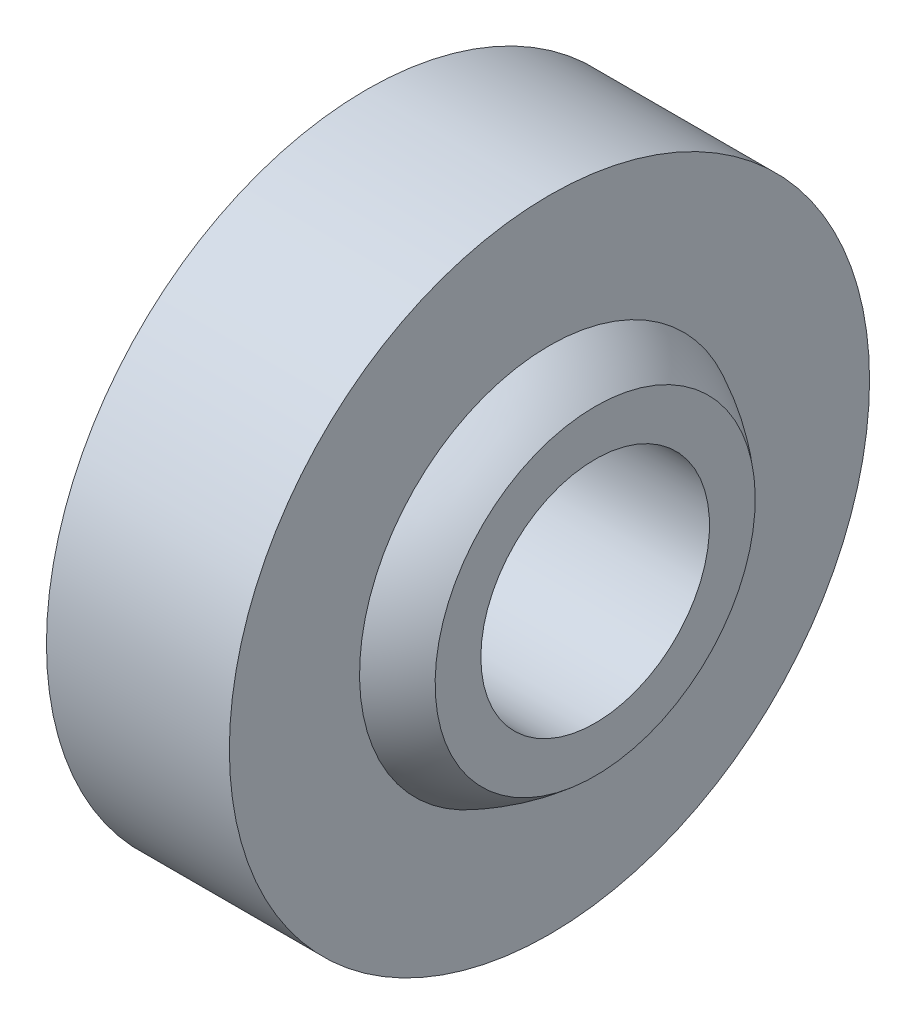
ISO-10303-21;
HEADER;
FILE_DESCRIPTION(('STEP AP214'),'2;1');
FILE_NAME('part.step','',(''),(''),'','','');
FILE_SCHEMA(('AUTOMOTIVE_DESIGN { 1 0 10303 214 1 1 1 1 }'));
ENDSEC;
DATA;
#1=APPLICATION_CONTEXT('core data for automotive mechanical design processes');
#2=APPLICATION_PROTOCOL_DEFINITION('international standard','automotive_design',2000,#1);
#3=PRODUCT_CONTEXT('',#1,'mechanical');
#4=PRODUCT('Part','Part','',(#3));
#5=PRODUCT_RELATED_PRODUCT_CATEGORY('part','',(#4));
#6=PRODUCT_DEFINITION_FORMATION('','',#4);
#7=PRODUCT_DEFINITION_CONTEXT('part definition',#1,'design');
#8=PRODUCT_DEFINITION('design','',#6,#7);
#9=PRODUCT_DEFINITION_SHAPE('','',#8);
#10=(LENGTH_UNIT() NAMED_UNIT(*) SI_UNIT(.MILLI.,.METRE.));
#11=(NAMED_UNIT(*) PLANE_ANGLE_UNIT() SI_UNIT($,.RADIAN.));
#12=(NAMED_UNIT(*) SI_UNIT($,.STERADIAN.) SOLID_ANGLE_UNIT());
#13=UNCERTAINTY_MEASURE_WITH_UNIT(LENGTH_MEASURE(1.E-05),#10,'distance_accuracy_value','');
#14=(GEOMETRIC_REPRESENTATION_CONTEXT(3) GLOBAL_UNCERTAINTY_ASSIGNED_CONTEXT((#13)) GLOBAL_UNIT_ASSIGNED_CONTEXT((#10,
#11,#12)) REPRESENTATION_CONTEXT('',''));
#15=CARTESIAN_POINT('',(0.,0.,0.));
#16=DIRECTION('',(0.,0.,1.));
#17=DIRECTION('',(1.,0.,0.));
#18=AXIS2_PLACEMENT_3D('',#15,#16,#17);
#19=CARTESIAN_POINT('',(0.,0.,0.));
#20=DIRECTION('',(-1.,0.,0.));
#21=DIRECTION('',(0.,1.,0.));
#22=AXIS2_PLACEMENT_3D('',#19,#20,#21);
#23=SPHERICAL_SURFACE('',#22,4.60977222864644);
#24=CARTESIAN_POINT('',(-3.,0.,0.));
#25=DIRECTION('',(-1.,0.,0.));
#26=DIRECTION('',(0.,0.,1.));
#27=AXIS2_PLACEMENT_3D('',#24,#25,#26);
#28=CIRCLE('',#27,3.5);
#29=CARTESIAN_POINT('',(-3.,3.5,0.));
#30=VERTEX_POINT('',#29);
#31=EDGE_CURVE('E48',#30,#30,#28,.T.);
#32=CARTESIAN_POINT('',(-2.,0.,0.));
#33=DIRECTION('',(1.,0.,0.));
#34=DIRECTION('',(0.,0.,-1.));
#35=AXIS2_PLACEMENT_3D('',#32,#33,#34);
#36=CIRCLE('',#35,4.15331193145904);
#37=CARTESIAN_POINT('',(-2.,4.15331193145904,0.));
#38=VERTEX_POINT('',#37);
#39=EDGE_CURVE('E10',#38,#38,#36,.T.);
#40=CARTESIAN_POINT('',(-3.,3.5,0.));
#41=CARTESIAN_POINT('',(-2.99052620611061,3.50812039634238,0.));
#42=CARTESIAN_POINT('',(-2.98101944028967,3.51620232540534,0.));
#43=CARTESIAN_POINT('',(-2.96194059506185,3.53228872007487,0.));
#44=CARTESIAN_POINT('',(-2.95236851565497,3.54029318568143,0.));
#45=CARTESIAN_POINT('',(-2.93315967353245,3.55622412454056,0.));
#46=CARTESIAN_POINT('',(-2.92352291081681,3.56415059779313,0.));
#47=CARTESIAN_POINT('',(-2.90418533777321,3.57992502955823,0.));
#48=CARTESIAN_POINT('',(-2.89448452744525,3.58777298807076,0.));
#49=CARTESIAN_POINT('',(-2.87501949878755,3.60338987278029,0.));
#50=CARTESIAN_POINT('',(-2.86525528045781,3.61115879897729,0.));
#51=CARTESIAN_POINT('',(-2.8456640796711,3.62661710678996,0.));
#52=CARTESIAN_POINT('',(-2.83583709721413,3.63430648840563,0.));
#53=CARTESIAN_POINT('',(-2.81612101616401,3.64960520000871,0.));
#54=CARTESIAN_POINT('',(-2.80623191757087,3.65721452999613,0.));
#55=CARTESIAN_POINT('',(-2.78639225634135,3.67235263658149,0.));
#56=CARTESIAN_POINT('',(-2.77644169370499,3.67988141317943,0.));
#57=CARTESIAN_POINT('',(-2.75647976053338,3.69485791653445,0.));
#58=CARTESIAN_POINT('',(-2.74646838999813,3.70230564329153,0.));
#59=CARTESIAN_POINT('',(-2.72638550118322,3.71711955585841,0.));
#60=CARTESIAN_POINT('',(-2.71631398290356,3.72448574166821,0.));
#61=CARTESIAN_POINT('',(-2.69611146272033,3.73913608661081,0.));
#62=CARTESIAN_POINT('',(-2.68598046081677,3.74642024574362,0.));
#63=CARTESIAN_POINT('',(-2.66565964142868,3.76090605701146,0.));
#64=CARTESIAN_POINT('',(-2.65546982394415,3.76810770914649,0.));
#65=CARTESIAN_POINT('',(-2.63503204531536,3.78242803153852,0.));
#66=CARTESIAN_POINT('',(-2.6247840841711,3.78954670179551,0.));
#67=CARTESIAN_POINT('',(-2.60423069397813,3.80370059102309,0.));
#68=CARTESIAN_POINT('',(-2.59392526492941,3.81073580999366,0.));
#69=CARTESIAN_POINT('',(-2.57325761847225,3.82472233274282,0.));
#70=CARTESIAN_POINT('',(-2.56289540106381,3.83167363652141,0.));
#71=CARTESIAN_POINT('',(-2.54211486117656,3.84549187051442,0.));
#72=CARTESIAN_POINT('',(-2.53169653869776,3.85235880072884,0.));
#73=CARTESIAN_POINT('',(-2.51080447565878,3.866007834785,0.));
#74=CARTESIAN_POINT('',(-2.5003307350986,3.87278993862674,0.));
#75=CARTESIAN_POINT('',(-2.47932852654012,3.88626887272247,0.));
#76=CARTESIAN_POINT('',(-2.46880005854182,3.89296570297647,0.));
#77=CARTESIAN_POINT('',(-2.44768908935913,3.90627364830467,0.));
#78=CARTESIAN_POINT('',(-2.43710658817473,3.91288476337887,0.));
#79=CARTESIAN_POINT('',(-2.41588825043483,3.9260208424075,0.));
#80=CARTESIAN_POINT('',(-2.40525241387933,3.93254580636194,0.));
#81=CARTESIAN_POINT('',(-2.38392810672916,3.94550915289192,0.));
#82=CARTESIAN_POINT('',(-2.3732396361345,3.95194753546746,0.));
#83=CARTESIAN_POINT('',(-2.35181076570868,3.96473729468976,0.));
#84=CARTESIAN_POINT('',(-2.34107036587753,3.97108867133652,0.));
#85=CARTESIAN_POINT('',(-2.31953834520562,3.98370399988854,0.));
#86=CARTESIAN_POINT('',(-2.30874672436486,3.9899679517938,0.));
#87=CARTESIAN_POINT('',(-2.28711297327821,4.002408017815,0.));
#88=CARTESIAN_POINT('',(-2.27627084303231,4.00858413193093,0.));
#89=CARTESIAN_POINT('',(-2.25453678807035,4.02084811511754,0.));
#90=CARTESIAN_POINT('',(-2.2436448633543,4.02693598418822,0.));
#91=CARTESIAN_POINT('',(-2.22181193767078,4.03902307584791,0.));
#92=CARTESIAN_POINT('',(-2.21087093670332,4.04502229843691,0.));
#93=CARTESIAN_POINT('',(-2.18894057997077,4.05693170154001,0.));
#94=CARTESIAN_POINT('',(-2.17795122420567,4.0628418820541,0.));
#95=CARTESIAN_POINT('',(-2.15592488252423,4.07457281129388,0.));
#96=CARTESIAN_POINT('',(-2.14488789660788,4.08039356001957,0.));
#97=CARTESIAN_POINT('',(-2.12276702239587,4.09194524183532,0.));
#98=CARTESIAN_POINT('',(-2.11168313410021,4.09767617492539,0.));
#99=CARTESIAN_POINT('',(-2.08946918605098,4.1090478476605,0.));
#100=CARTESIAN_POINT('',(-2.07833912629741,4.11468858730555,0.));
#101=CARTESIAN_POINT('',(-2.05603356908673,4.12587950085816,0.));
#102=CARTESIAN_POINT('',(-2.04485807162961,4.13142967476571,0.));
#103=CARTESIAN_POINT('',(-2.02246237655214,4.14243909212941,0.));
#104=CARTESIAN_POINT('',(-2.01124217893179,4.14789833558556,0.));
#105=CARTESIAN_POINT('',(-2.,4.15331193145904,0.));
#106=B_SPLINE_CURVE_WITH_KNOTS('',3,(#40,#41,#42,#43,#44,#45,#46,#47,#48,#49,#50,#51,#52,#53,
#54,#55,#56,#57,#58,#59,#60,#61,#62,#63,#64,#65,#66,#67,#68,#69,#70,#71,#72,#73,#74,#75,#76,#77,
#78,#79,#80,#81,#82,#83,#84,#85,#86,#87,#88,#89,#90,#91,#92,#93,#94,#95,#96,#97,#98,#99,#100,
#101,#102,#103,#104,#105),.UNSPECIFIED.,.F.,.F.,(4,2,2,2,2,2,2,2,2,2,2,2,2,2,2,2,2,2,2,2,2,2,2,
2,2,2,2,2,2,2,2,2,4),(0.,0.0374330704687181,0.0748661409374359,0.112299211406154,
0.149732281874872,0.187165352343589,0.224598422812307,0.262031493281025,0.299464563749743,
0.336897634218461,0.374330704687179,0.411763775155897,0.449196845624614,0.486629916093332,
0.52406298656205,0.561496057030768,0.598929127499486,0.636362197968204,0.673795268436922,
0.711228338905639,0.748661409374358,0.786094479843075,0.823527550311794,0.860960620780511,
0.898393691249229,0.935826761717947,0.973259832186665,1.01069290265538,1.0481259731241,
1.08555904359282,1.12299211406154,1.16042518453025,1.19785825499897),.UNSPECIFIED.);
#107=EDGE_CURVE('BSEAM38',#30,#38,#106,.T.);
#108=ORIENTED_EDGE('',*,*,#31,.F.);
#109=ORIENTED_EDGE('',*,*,#39,.F.);
#110=ORIENTED_EDGE('',*,*,#107,.T.);
#111=ORIENTED_EDGE('',*,*,#107,.F.);
#112=EDGE_LOOP('',(#108,#110,#109,#111));
#113=FACE_BOUND('',#112,.T.);
#114=ADVANCED_FACE('F38',(#113),#23,.T.);
#115=CARTESIAN_POINT('',(3.,0.,0.));
#116=DIRECTION('',(-1.,0.,0.));
#117=DIRECTION('',(0.,0.,1.));
#118=AXIS2_PLACEMENT_3D('',#115,#116,#117);
#119=CIRCLE('',#118,3.5);
#120=CARTESIAN_POINT('',(3.,3.5,0.));
#121=VERTEX_POINT('',#120);
#122=EDGE_CURVE('E60',#121,#121,#119,.T.);
#123=CARTESIAN_POINT('',(2.,0.,0.));
#124=DIRECTION('',(-1.,0.,0.));
#125=DIRECTION('',(0.,0.,1.));
#126=AXIS2_PLACEMENT_3D('',#123,#124,#125);
#127=CIRCLE('',#126,4.15331193145904);
#128=CARTESIAN_POINT('',(2.,4.15331193145904,0.));
#129=VERTEX_POINT('',#128);
#130=EDGE_CURVE('E44',#129,#129,#127,.T.);
#131=CARTESIAN_POINT('',(3.,3.5,0.));
#132=CARTESIAN_POINT('',(2.99052620611061,3.50812039634238,0.));
#133=CARTESIAN_POINT('',(2.98101944028967,3.51620232540534,0.));
#134=CARTESIAN_POINT('',(2.96194059506185,3.53228872007487,0.));
#135=CARTESIAN_POINT('',(2.95236851565497,3.54029318568143,0.));
#136=CARTESIAN_POINT('',(2.93315967353245,3.55622412454056,0.));
#137=CARTESIAN_POINT('',(2.92352291081681,3.56415059779313,0.));
#138=CARTESIAN_POINT('',(2.90418533777321,3.57992502955823,0.));
#139=CARTESIAN_POINT('',(2.89448452744525,3.58777298807076,0.));
#140=CARTESIAN_POINT('',(2.87501949878755,3.60338987278029,0.));
#141=CARTESIAN_POINT('',(2.86525528045781,3.61115879897729,0.));
#142=CARTESIAN_POINT('',(2.8456640796711,3.62661710678996,0.));
#143=CARTESIAN_POINT('',(2.83583709721413,3.63430648840563,0.));
#144=CARTESIAN_POINT('',(2.81612101616401,3.64960520000871,0.));
#145=CARTESIAN_POINT('',(2.80623191757086,3.65721452999613,0.));
#146=CARTESIAN_POINT('',(2.78639225634135,3.67235263658149,0.));
#147=CARTESIAN_POINT('',(2.77644169370499,3.67988141317943,0.));
#148=CARTESIAN_POINT('',(2.75647976053338,3.69485791653445,0.));
#149=CARTESIAN_POINT('',(2.74646838999813,3.70230564329153,0.));
#150=CARTESIAN_POINT('',(2.72638550118322,3.71711955585841,0.));
#151=CARTESIAN_POINT('',(2.71631398290356,3.72448574166821,0.));
#152=CARTESIAN_POINT('',(2.69611146272034,3.73913608661081,0.));
#153=CARTESIAN_POINT('',(2.68598046081677,3.74642024574362,0.));
#154=CARTESIAN_POINT('',(2.66565964142868,3.76090605701146,0.));
#155=CARTESIAN_POINT('',(2.65546982394415,3.76810770914649,0.));
#156=CARTESIAN_POINT('',(2.63503204531536,3.78242803153852,0.));
#157=CARTESIAN_POINT('',(2.6247840841711,3.78954670179551,0.));
#158=CARTESIAN_POINT('',(2.60423069397813,3.80370059102309,0.));
#159=CARTESIAN_POINT('',(2.59392526492941,3.81073580999366,0.));
#160=CARTESIAN_POINT('',(2.57325761847225,3.82472233274282,0.));
#161=CARTESIAN_POINT('',(2.56289540106381,3.83167363652141,0.));
#162=CARTESIAN_POINT('',(2.54211486117656,3.84549187051441,0.));
#163=CARTESIAN_POINT('',(2.53169653869776,3.85235880072884,0.));
#164=CARTESIAN_POINT('',(2.51080447565878,3.866007834785,0.));
#165=CARTESIAN_POINT('',(2.5003307350986,3.87278993862674,0.));
#166=CARTESIAN_POINT('',(2.47932852654012,3.88626887272247,0.));
#167=CARTESIAN_POINT('',(2.46880005854182,3.89296570297647,0.));
#168=CARTESIAN_POINT('',(2.44768908935913,3.90627364830467,0.));
#169=CARTESIAN_POINT('',(2.43710658817473,3.91288476337887,0.));
#170=CARTESIAN_POINT('',(2.41588825043483,3.9260208424075,0.));
#171=CARTESIAN_POINT('',(2.40525241387933,3.93254580636194,0.));
#172=CARTESIAN_POINT('',(2.38392810672916,3.94550915289192,0.));
#173=CARTESIAN_POINT('',(2.3732396361345,3.95194753546746,0.));
#174=CARTESIAN_POINT('',(2.35181076570868,3.96473729468976,0.));
#175=CARTESIAN_POINT('',(2.34107036587753,3.97108867133652,0.));
#176=CARTESIAN_POINT('',(2.31953834520562,3.98370399988854,0.));
#177=CARTESIAN_POINT('',(2.30874672436486,3.9899679517938,0.));
#178=CARTESIAN_POINT('',(2.28711297327821,4.002408017815,0.));
#179=CARTESIAN_POINT('',(2.27627084303231,4.00858413193093,0.));
#180=CARTESIAN_POINT('',(2.25453678807035,4.02084811511754,0.));
#181=CARTESIAN_POINT('',(2.2436448633543,4.02693598418822,0.));
#182=CARTESIAN_POINT('',(2.22181193767078,4.03902307584791,0.));
#183=CARTESIAN_POINT('',(2.21087093670332,4.04502229843691,0.));
#184=CARTESIAN_POINT('',(2.18894057997077,4.05693170154001,0.));
#185=CARTESIAN_POINT('',(2.17795122420567,4.0628418820541,0.));
#186=CARTESIAN_POINT('',(2.15592488252423,4.07457281129388,0.));
#187=CARTESIAN_POINT('',(2.14488789660788,4.08039356001957,0.));
#188=CARTESIAN_POINT('',(2.12276702239587,4.09194524183532,0.));
#189=CARTESIAN_POINT('',(2.11168313410021,4.09767617492539,0.));
#190=CARTESIAN_POINT('',(2.08946918605098,4.1090478476605,0.));
#191=CARTESIAN_POINT('',(2.07833912629741,4.11468858730555,0.));
#192=CARTESIAN_POINT('',(2.05603356908673,4.12587950085816,0.));
#193=CARTESIAN_POINT('',(2.04485807162961,4.13142967476571,0.));
#194=CARTESIAN_POINT('',(2.02246237655214,4.14243909212941,0.));
#195=CARTESIAN_POINT('',(2.01124217893179,4.14789833558556,0.));
#196=CARTESIAN_POINT('',(2.,4.15331193145904,0.));
#197=B_SPLINE_CURVE_WITH_KNOTS('',3,(#131,#132,#133,#134,#135,#136,#137,#138,#139,#140,#141,
#142,#143,#144,#145,#146,#147,#148,#149,#150,#151,#152,#153,#154,#155,#156,#157,#158,#159,#160,
#161,#162,#163,#164,#165,#166,#167,#168,#169,#170,#171,#172,#173,#174,#175,#176,#177,#178,#179,
#180,#181,#182,#183,#184,#185,#186,#187,#188,#189,#190,#191,#192,#193,#194,#195,#196),
.UNSPECIFIED.,.F.,.F.,(4,2,2,2,2,2,2,2,2,2,2,2,2,2,2,2,2,2,2,2,2,2,2,2,2,2,2,2,2,2,2,2,4),(0.,
0.0374330704687175,0.0748661409374359,0.112299211406154,0.149732281874872,0.18716535234359,
0.224598422812308,0.262031493281025,0.299464563749743,0.336897634218461,0.374330704687179,
0.411763775155897,0.449196845624615,0.486629916093333,0.524062986562051,0.561496057030768,
0.598929127499487,0.636362197968205,0.673795268436923,0.711228338905641,0.748661409374359,
0.786094479843076,0.823527550311795,0.860960620780512,0.89839369124923,0.935826761717948,
0.973259832186667,1.01069290265538,1.0481259731241,1.08555904359282,1.12299211406154,
1.16042518453026,1.19785825499897),.UNSPECIFIED.);
#198=EDGE_CURVE('BSEAM87',#121,#129,#197,.T.);
#199=ORIENTED_EDGE('',*,*,#122,.T.);
#200=ORIENTED_EDGE('',*,*,#130,.F.);
#201=ORIENTED_EDGE('',*,*,#198,.T.);
#202=ORIENTED_EDGE('',*,*,#198,.F.);
#203=EDGE_LOOP('',(#199,#201,#200,#202));
#204=FACE_BOUND('',#203,.T.);
#205=ADVANCED_FACE('F87',(#204),#23,.T.);
#206=CARTESIAN_POINT('',(-3.,3.5,0.));
#207=DIRECTION('',(1.,0.,0.));
#208=DIRECTION('',(0.,0.,-1.));
#209=AXIS2_PLACEMENT_3D('',#206,#207,#208);
#210=PLANE('',#209);
#211=CARTESIAN_POINT('',(-3.,0.,0.));
#212=DIRECTION('',(-1.,0.,0.));
#213=DIRECTION('',(0.,0.,1.));
#214=AXIS2_PLACEMENT_3D('',#211,#212,#213);
#215=CIRCLE('',#214,2.5);
#216=CARTESIAN_POINT('',(-3.,0.,2.5));
#217=VERTEX_POINT('',#216);
#218=EDGE_CURVE('E52',#217,#217,#215,.T.);
#219=ORIENTED_EDGE('',*,*,#218,.F.);
#220=EDGE_LOOP('',(#219));
#221=FACE_BOUND('',#220,.T.);
#222=ORIENTED_EDGE('',*,*,#31,.T.);
#223=EDGE_LOOP('',(#222));
#224=FACE_BOUND('',#223,.T.);
#225=ADVANCED_FACE('F92',(#221,#224),#210,.F.);
#226=CARTESIAN_POINT('',(-2.95583633269187,0.,0.));
#227=DIRECTION('',(-1.,0.,0.));
#228=DIRECTION('',(0.,0.,1.));
#229=AXIS2_PLACEMENT_3D('',#226,#227,#228);
#230=CYLINDRICAL_SURFACE('',#229,2.5);
#231=CARTESIAN_POINT('',(3.,0.,0.));
#232=DIRECTION('',(-1.,0.,0.));
#233=DIRECTION('',(0.,0.,1.));
#234=AXIS2_PLACEMENT_3D('',#231,#232,#233);
#235=CIRCLE('',#234,2.5);
#236=CARTESIAN_POINT('',(3.,0.,2.5));
#237=VERTEX_POINT('',#236);
#238=EDGE_CURVE('E57',#237,#237,#235,.T.);
#239=ORIENTED_EDGE('',*,*,#238,.F.);
#240=EDGE_LOOP('',(#239));
#241=FACE_BOUND('',#240,.T.);
#242=ORIENTED_EDGE('',*,*,#218,.T.);
#243=EDGE_LOOP('',(#242));
#244=FACE_BOUND('',#243,.T.);
#245=ADVANCED_FACE('F98',(#241,#244),#230,.F.);
#246=CARTESIAN_POINT('',(3.,3.5,0.));
#247=DIRECTION('',(-1.,0.,0.));
#248=DIRECTION('',(0.,0.,1.));
#249=AXIS2_PLACEMENT_3D('',#246,#247,#248);
#250=PLANE('',#249);
#251=ORIENTED_EDGE('',*,*,#122,.F.);
#252=EDGE_LOOP('',(#251));
#253=FACE_BOUND('',#252,.T.);
#254=ORIENTED_EDGE('',*,*,#238,.T.);
#255=EDGE_LOOP('',(#254));
#256=FACE_BOUND('',#255,.T.);
#257=ADVANCED_FACE('F84',(#253,#256),#250,.F.);
#258=CARTESIAN_POINT('',(-2.,7.,0.));
#259=DIRECTION('',(1.,0.,0.));
#260=DIRECTION('',(0.,0.,-1.));
#261=AXIS2_PLACEMENT_3D('',#258,#259,#260);
#262=PLANE('',#261);
#263=ORIENTED_EDGE('',*,*,#39,.T.);
#264=EDGE_LOOP('',(#263));
#265=FACE_BOUND('',#264,.T.);
#266=CARTESIAN_POINT('',(-2.,0.,0.));
#267=DIRECTION('',(-1.,0.,0.));
#268=DIRECTION('',(0.,0.,1.));
#269=AXIS2_PLACEMENT_3D('',#266,#267,#268);
#270=CIRCLE('',#269,7.);
#271=CARTESIAN_POINT('',(-2.,0.,7.));
#272=VERTEX_POINT('',#271);
#273=EDGE_CURVE('E66',#272,#272,#270,.T.);
#274=ORIENTED_EDGE('',*,*,#273,.T.);
#275=EDGE_LOOP('',(#274));
#276=FACE_BOUND('',#275,.T.);
#277=ADVANCED_FACE('F70',(#265,#276),#262,.F.);
#278=CARTESIAN_POINT('',(2.,7.,0.));
#279=DIRECTION('',(-1.,0.,0.));
#280=DIRECTION('',(0.,0.,1.));
#281=AXIS2_PLACEMENT_3D('',#278,#279,#280);
#282=PLANE('',#281);
#283=CARTESIAN_POINT('',(2.,0.,0.));
#284=DIRECTION('',(-1.,0.,0.));
#285=DIRECTION('',(0.,0.,1.));
#286=AXIS2_PLACEMENT_3D('',#283,#284,#285);
#287=CIRCLE('',#286,7.);
#288=CARTESIAN_POINT('',(2.,0.,7.));
#289=VERTEX_POINT('',#288);
#290=EDGE_CURVE('E63',#289,#289,#287,.T.);
#291=ORIENTED_EDGE('',*,*,#290,.F.);
#292=EDGE_LOOP('',(#291));
#293=FACE_BOUND('',#292,.T.);
#294=ORIENTED_EDGE('',*,*,#130,.T.);
#295=EDGE_LOOP('',(#294));
#296=FACE_BOUND('',#295,.T.);
#297=ADVANCED_FACE('F75',(#293,#296),#282,.F.);
#298=CARTESIAN_POINT('',(-4.35580874527011,0.,0.));
#299=DIRECTION('',(-1.,0.,0.));
#300=DIRECTION('',(0.,0.,1.));
#301=AXIS2_PLACEMENT_3D('',#298,#299,#300);
#302=CYLINDRICAL_SURFACE('',#301,7.);
#303=ORIENTED_EDGE('',*,*,#273,.F.);
#304=EDGE_LOOP('',(#303));
#305=FACE_BOUND('',#304,.T.);
#306=ORIENTED_EDGE('',*,*,#290,.T.);
#307=EDGE_LOOP('',(#306));
#308=FACE_BOUND('',#307,.T.);
#309=ADVANCED_FACE('F72',(#305,#308),#302,.T.);
#310=CLOSED_SHELL('',(#114,#205,#225,#245,#257,#277,#297,#309));
#311=MANIFOLD_SOLID_BREP('B2',#310);
#312=ADVANCED_BREP_SHAPE_REPRESENTATION('',(#18,#311),#14);
#313=SHAPE_DEFINITION_REPRESENTATION(#9,#312);
ENDSEC;
END-ISO-10303-21;
